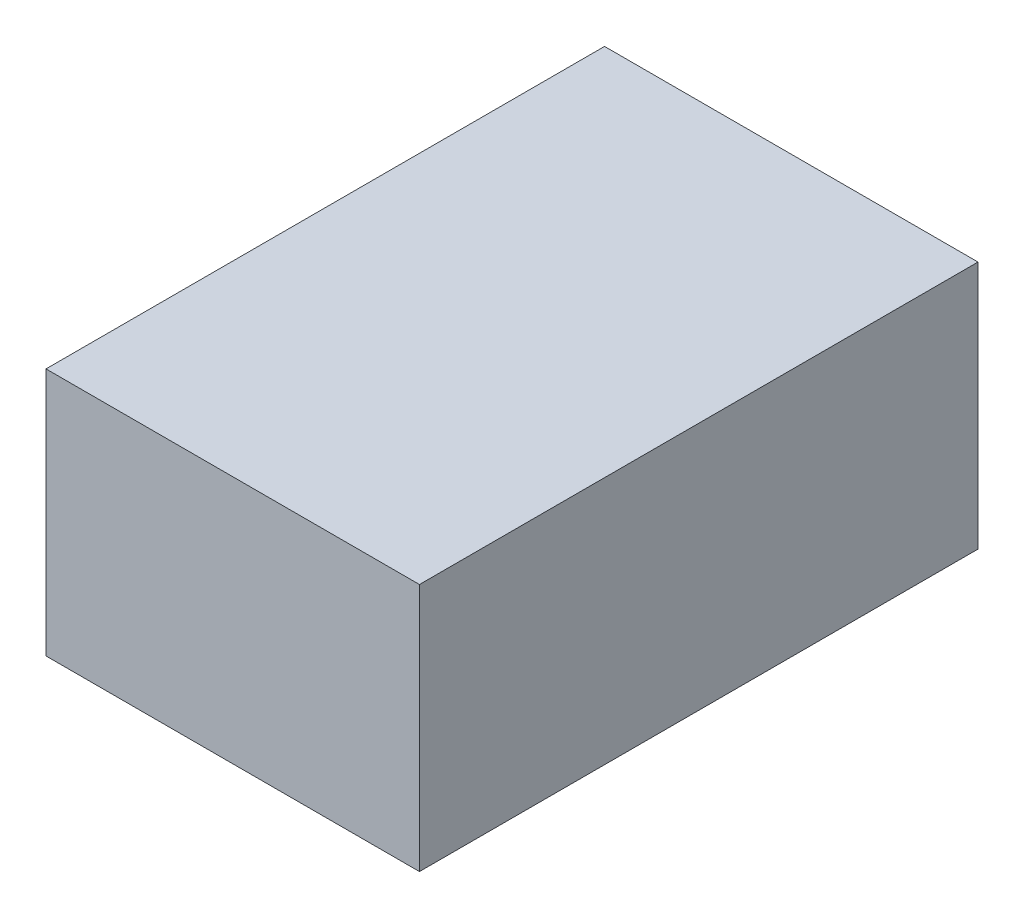
ISO-10303-21;
HEADER;
FILE_DESCRIPTION(('STEP AP214'),'2;1');
FILE_NAME('part.step','',(''),(''),'','','');
FILE_SCHEMA(('AUTOMOTIVE_DESIGN { 1 0 10303 214 1 1 1 1 }'));
ENDSEC;
DATA;
#1=APPLICATION_CONTEXT('core data for automotive mechanical design processes');
#2=APPLICATION_PROTOCOL_DEFINITION('international standard','automotive_design',2000,#1);
#3=PRODUCT_CONTEXT('',#1,'mechanical');
#4=PRODUCT('Part','Part','',(#3));
#5=PRODUCT_RELATED_PRODUCT_CATEGORY('part','',(#4));
#6=PRODUCT_DEFINITION_FORMATION('','',#4);
#7=PRODUCT_DEFINITION_CONTEXT('part definition',#1,'design');
#8=PRODUCT_DEFINITION('design','',#6,#7);
#9=PRODUCT_DEFINITION_SHAPE('','',#8);
#10=(LENGTH_UNIT() NAMED_UNIT(*) SI_UNIT(.MILLI.,.METRE.));
#11=(NAMED_UNIT(*) PLANE_ANGLE_UNIT() SI_UNIT($,.RADIAN.));
#12=(NAMED_UNIT(*) SI_UNIT($,.STERADIAN.) SOLID_ANGLE_UNIT());
#13=UNCERTAINTY_MEASURE_WITH_UNIT(LENGTH_MEASURE(1.E-05),#10,'distance_accuracy_value','');
#14=(GEOMETRIC_REPRESENTATION_CONTEXT(3) GLOBAL_UNCERTAINTY_ASSIGNED_CONTEXT((#13)) GLOBAL_UNIT_ASSIGNED_CONTEXT((#10,
#11,#12)) REPRESENTATION_CONTEXT('',''));
#15=CARTESIAN_POINT('',(0.,0.,0.));
#16=DIRECTION('',(0.,0.,1.));
#17=DIRECTION('',(1.,0.,0.));
#18=AXIS2_PLACEMENT_3D('',#15,#16,#17);
#19=CARTESIAN_POINT('',(33.96615,22.61235,-101.6));
#20=DIRECTION('',(1.,0.,0.));
#21=DIRECTION('',(0.,1.,0.));
#22=AXIS2_PLACEMENT_3D('',#19,#20,#21);
#23=PLANE('',#22);
#24=DIRECTION('',(0.,1.,0.));
#25=VECTOR('',#24,1.);
#26=CARTESIAN_POINT('',(33.96615,22.61235,0.));
#27=LINE('',#26,#25);
#28=CARTESIAN_POINT('',(33.96615,-22.61235,0.));
#29=VERTEX_POINT('',#28);
#30=CARTESIAN_POINT('',(33.96615,22.61235,0.));
#31=VERTEX_POINT('',#30);
#32=EDGE_CURVE('E95',#29,#31,#27,.T.);
#33=ORIENTED_EDGE('',*,*,#32,.F.);
#34=DIRECTION('',(0.,0.,1.));
#35=VECTOR('',#34,1.);
#36=CARTESIAN_POINT('',(33.96615,-22.61235,-101.6));
#37=LINE('',#36,#35);
#38=CARTESIAN_POINT('',(33.96615,-22.61235,-101.6));
#39=VERTEX_POINT('',#38);
#40=EDGE_CURVE('E11',#39,#29,#37,.T.);
#41=ORIENTED_EDGE('',*,*,#40,.F.);
#42=DIRECTION('',(0.,1.,0.));
#43=VECTOR('',#42,1.);
#44=CARTESIAN_POINT('',(33.96615,22.61235,-101.6));
#45=LINE('',#44,#43);
#46=CARTESIAN_POINT('',(33.96615,22.61235,-101.6));
#47=VERTEX_POINT('',#46);
#48=EDGE_CURVE('E89',#39,#47,#45,.T.);
#49=ORIENTED_EDGE('',*,*,#48,.T.);
#50=DIRECTION('',(0.,0.,1.));
#51=VECTOR('',#50,1.);
#52=CARTESIAN_POINT('',(33.96615,22.61235,-101.6));
#53=LINE('',#52,#51);
#54=EDGE_CURVE('E34',#47,#31,#53,.T.);
#55=ORIENTED_EDGE('',*,*,#54,.T.);
#56=EDGE_LOOP('',(#33,#41,#49,#55));
#57=FACE_BOUND('',#56,.T.);
#58=ADVANCED_FACE('F31',(#57),#23,.T.);
#59=CARTESIAN_POINT('',(-33.96615,-22.61235,-101.6));
#60=DIRECTION('',(0.,-1.,0.));
#61=DIRECTION('',(0.,0.,-1.));
#62=AXIS2_PLACEMENT_3D('',#59,#60,#61);
#63=PLANE('',#62);
#64=DIRECTION('',(1.,0.,0.));
#65=VECTOR('',#64,1.);
#66=CARTESIAN_POINT('',(-33.96615,-22.61235,0.));
#67=LINE('',#66,#65);
#68=CARTESIAN_POINT('',(-33.96615,-22.61235,0.));
#69=VERTEX_POINT('',#68);
#70=EDGE_CURVE('E91',#69,#29,#67,.T.);
#71=ORIENTED_EDGE('',*,*,#70,.F.);
#72=DIRECTION('',(0.,0.,1.));
#73=VECTOR('',#72,1.);
#74=CARTESIAN_POINT('',(-33.96615,-22.61235,-101.6));
#75=LINE('',#74,#73);
#76=CARTESIAN_POINT('',(-33.96615,-22.61235,-101.6));
#77=VERTEX_POINT('',#76);
#78=EDGE_CURVE('E40',#77,#69,#75,.T.);
#79=ORIENTED_EDGE('',*,*,#78,.F.);
#80=DIRECTION('',(1.,0.,0.));
#81=VECTOR('',#80,1.);
#82=CARTESIAN_POINT('',(-33.96615,-22.61235,-101.6));
#83=LINE('',#82,#81);
#84=EDGE_CURVE('E86',#77,#39,#83,.T.);
#85=ORIENTED_EDGE('',*,*,#84,.T.);
#86=ORIENTED_EDGE('',*,*,#40,.T.);
#87=EDGE_LOOP('',(#71,#79,#85,#86));
#88=FACE_BOUND('',#87,.T.);
#89=ADVANCED_FACE('F105',(#88),#63,.T.);
#90=CARTESIAN_POINT('',(-33.96615,22.61235,-101.6));
#91=DIRECTION('',(-1.,0.,0.));
#92=DIRECTION('',(0.,-1.,0.));
#93=AXIS2_PLACEMENT_3D('',#90,#91,#92);
#94=PLANE('',#93);
#95=DIRECTION('',(0.,-1.,0.));
#96=VECTOR('',#95,1.);
#97=CARTESIAN_POINT('',(-33.96615,22.61235,0.));
#98=LINE('',#97,#96);
#99=CARTESIAN_POINT('',(-33.96615,22.61235,0.));
#100=VERTEX_POINT('',#99);
#101=EDGE_CURVE('E81',#100,#69,#98,.T.);
#102=ORIENTED_EDGE('',*,*,#101,.F.);
#103=DIRECTION('',(0.,0.,1.));
#104=VECTOR('',#103,1.);
#105=CARTESIAN_POINT('',(-33.96615,22.61235,-101.6));
#106=LINE('',#105,#104);
#107=CARTESIAN_POINT('',(-33.96615,22.61235,-101.6));
#108=VERTEX_POINT('',#107);
#109=EDGE_CURVE('E76',#108,#100,#106,.T.);
#110=ORIENTED_EDGE('',*,*,#109,.F.);
#111=DIRECTION('',(0.,-1.,0.));
#112=VECTOR('',#111,1.);
#113=CARTESIAN_POINT('',(-33.96615,22.61235,-101.6));
#114=LINE('',#113,#112);
#115=EDGE_CURVE('E79',#108,#77,#114,.T.);
#116=ORIENTED_EDGE('',*,*,#115,.T.);
#117=ORIENTED_EDGE('',*,*,#78,.T.);
#118=EDGE_LOOP('',(#102,#110,#116,#117));
#119=FACE_BOUND('',#118,.T.);
#120=ADVANCED_FACE('F78',(#119),#94,.T.);
#121=CARTESIAN_POINT('',(-33.96615,22.61235,-101.6));
#122=DIRECTION('',(0.,1.,0.));
#123=DIRECTION('',(0.,0.,1.));
#124=AXIS2_PLACEMENT_3D('',#121,#122,#123);
#125=PLANE('',#124);
#126=DIRECTION('',(-1.,0.,0.));
#127=VECTOR('',#126,1.);
#128=CARTESIAN_POINT('',(-33.96615,22.61235,0.));
#129=LINE('',#128,#127);
#130=EDGE_CURVE('E98',#31,#100,#129,.T.);
#131=ORIENTED_EDGE('',*,*,#130,.F.);
#132=ORIENTED_EDGE('',*,*,#54,.F.);
#133=DIRECTION('',(-1.,0.,0.));
#134=VECTOR('',#133,1.);
#135=CARTESIAN_POINT('',(-33.96615,22.61235,-101.6));
#136=LINE('',#135,#134);
#137=EDGE_CURVE('E85',#47,#108,#136,.T.);
#138=ORIENTED_EDGE('',*,*,#137,.T.);
#139=ORIENTED_EDGE('',*,*,#109,.T.);
#140=EDGE_LOOP('',(#131,#132,#138,#139));
#141=FACE_BOUND('',#140,.T.);
#142=ADVANCED_FACE('F88',(#141),#125,.T.);
#143=CARTESIAN_POINT('',(33.96615,-22.61235,-101.6));
#144=DIRECTION('',(0.,0.,1.));
#145=DIRECTION('',(1.,0.,0.));
#146=AXIS2_PLACEMENT_3D('',#143,#144,#145);
#147=PLANE('',#146);
#148=ORIENTED_EDGE('',*,*,#48,.F.);
#149=ORIENTED_EDGE('',*,*,#84,.F.);
#150=ORIENTED_EDGE('',*,*,#115,.F.);
#151=ORIENTED_EDGE('',*,*,#137,.F.);
#152=EDGE_LOOP('',(#148,#149,#150,#151));
#153=FACE_BOUND('',#152,.T.);
#154=ADVANCED_FACE('F84',(#153),#147,.F.);
#155=CARTESIAN_POINT('',(33.96615,-22.61235,0.));
#156=DIRECTION('',(0.,0.,1.));
#157=DIRECTION('',(1.,0.,0.));
#158=AXIS2_PLACEMENT_3D('',#155,#156,#157);
#159=PLANE('',#158);
#160=ORIENTED_EDGE('',*,*,#32,.T.);
#161=ORIENTED_EDGE('',*,*,#130,.T.);
#162=ORIENTED_EDGE('',*,*,#101,.T.);
#163=ORIENTED_EDGE('',*,*,#70,.T.);
#164=EDGE_LOOP('',(#160,#161,#162,#163));
#165=FACE_BOUND('',#164,.T.);
#166=ADVANCED_FACE('F104',(#165),#159,.T.);
#167=CLOSED_SHELL('',(#58,#89,#120,#142,#154,#166));
#168=MANIFOLD_SOLID_BREP('B2',#167);
#169=ADVANCED_BREP_SHAPE_REPRESENTATION('',(#18,#168),#14);
#170=SHAPE_DEFINITION_REPRESENTATION(#9,#169);
ENDSEC;
END-ISO-10303-21;
